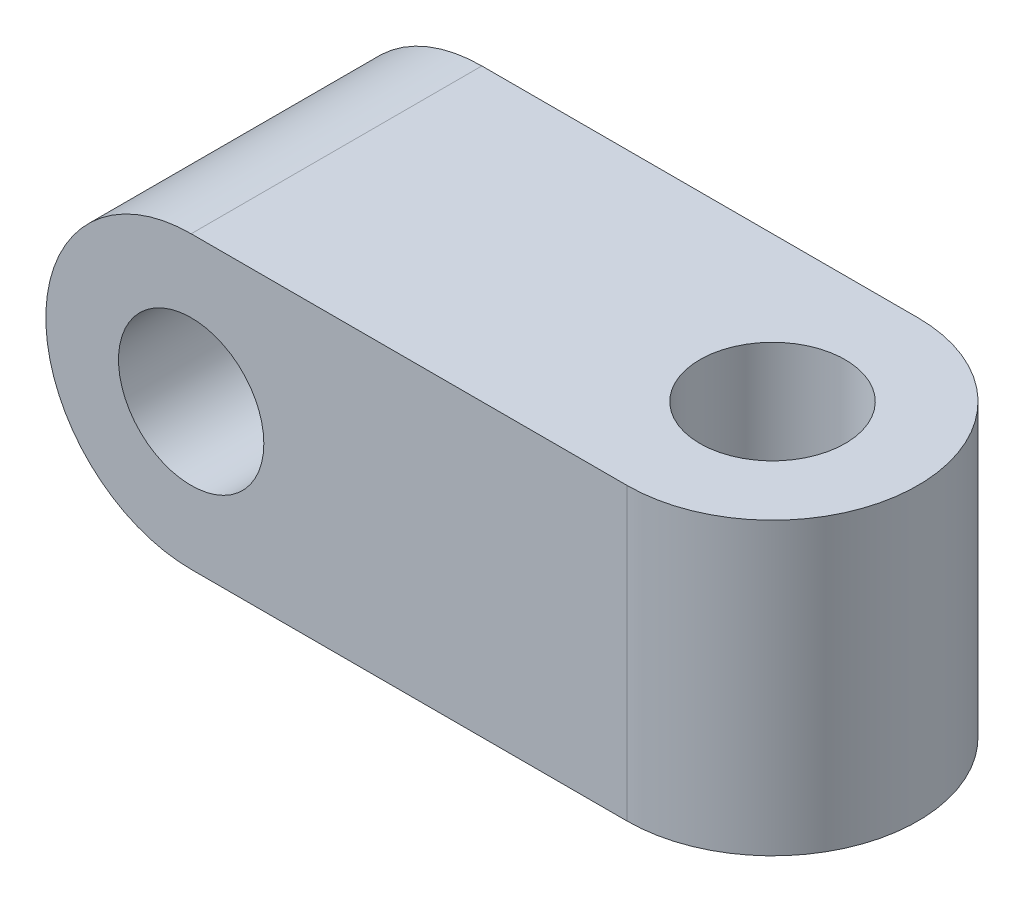
ISO-10303-21;
HEADER;
FILE_DESCRIPTION(('STEP AP214'),'2;1');
FILE_NAME('part.step','',(''),(''),'','','');
FILE_SCHEMA(('AUTOMOTIVE_DESIGN { 1 0 10303 214 1 1 1 1 }'));
ENDSEC;
DATA;
#1=APPLICATION_CONTEXT('core data for automotive mechanical design processes');
#2=APPLICATION_PROTOCOL_DEFINITION('international standard','automotive_design',2000,#1);
#3=PRODUCT_CONTEXT('',#1,'mechanical');
#4=PRODUCT('Part','Part','',(#3));
#5=PRODUCT_RELATED_PRODUCT_CATEGORY('part','',(#4));
#6=PRODUCT_DEFINITION_FORMATION('','',#4);
#7=PRODUCT_DEFINITION_CONTEXT('part definition',#1,'design');
#8=PRODUCT_DEFINITION('design','',#6,#7);
#9=PRODUCT_DEFINITION_SHAPE('','',#8);
#10=(LENGTH_UNIT() NAMED_UNIT(*) SI_UNIT(.MILLI.,.METRE.));
#11=(NAMED_UNIT(*) PLANE_ANGLE_UNIT() SI_UNIT($,.RADIAN.));
#12=(NAMED_UNIT(*) SI_UNIT($,.STERADIAN.) SOLID_ANGLE_UNIT());
#13=UNCERTAINTY_MEASURE_WITH_UNIT(LENGTH_MEASURE(1.E-05),#10,'distance_accuracy_value','');
#14=(GEOMETRIC_REPRESENTATION_CONTEXT(3) GLOBAL_UNCERTAINTY_ASSIGNED_CONTEXT((#13)) GLOBAL_UNIT_ASSIGNED_CONTEXT((#10,
#11,#12)) REPRESENTATION_CONTEXT('',''));
#15=CARTESIAN_POINT('',(0.,0.,0.));
#16=DIRECTION('',(0.,0.,1.));
#17=DIRECTION('',(1.,0.,0.));
#18=AXIS2_PLACEMENT_3D('',#15,#16,#17);
#19=CARTESIAN_POINT('',(0.,0.,4.));
#20=DIRECTION('',(0.,0.,-1.));
#21=DIRECTION('',(-1.,0.,0.));
#22=AXIS2_PLACEMENT_3D('',#19,#20,#21);
#23=CYLINDRICAL_SURFACE('',#22,2.);
#24=DIRECTION('',(0.,0.,1.));
#25=VECTOR('',#24,1.);
#26=CARTESIAN_POINT('',(0.,-2.,0.));
#27=LINE('',#26,#25);
#28=CARTESIAN_POINT('',(0.,-2.,0.));
#29=VERTEX_POINT('',#28);
#30=CARTESIAN_POINT('',(0.,-2.,4.));
#31=VERTEX_POINT('',#30);
#32=EDGE_CURVE('E55',#29,#31,#27,.T.);
#33=ORIENTED_EDGE('',*,*,#32,.T.);
#34=CARTESIAN_POINT('',(0.,0.,4.));
#35=DIRECTION('',(0.,0.,1.));
#36=DIRECTION('',(1.,0.,0.));
#37=AXIS2_PLACEMENT_3D('',#34,#35,#36);
#38=CIRCLE('',#37,2.);
#39=CARTESIAN_POINT('',(0.,2.,4.));
#40=VERTEX_POINT('',#39);
#41=EDGE_CURVE('E11',#40,#31,#38,.T.);
#42=ORIENTED_EDGE('',*,*,#41,.F.);
#43=DIRECTION('',(0.,0.,1.));
#44=VECTOR('',#43,1.);
#45=CARTESIAN_POINT('',(0.,2.,0.));
#46=LINE('',#45,#44);
#47=CARTESIAN_POINT('',(0.,2.,0.));
#48=VERTEX_POINT('',#47);
#49=EDGE_CURVE('E86',#48,#40,#46,.T.);
#50=ORIENTED_EDGE('',*,*,#49,.F.);
#51=CARTESIAN_POINT('',(0.,0.,0.));
#52=DIRECTION('',(0.,0.,1.));
#53=DIRECTION('',(1.,0.,0.));
#54=AXIS2_PLACEMENT_3D('',#51,#52,#53);
#55=CIRCLE('',#54,2.);
#56=EDGE_CURVE('E44',#48,#29,#55,.T.);
#57=ORIENTED_EDGE('',*,*,#56,.T.);
#58=EDGE_LOOP('',(#33,#42,#50,#57));
#59=FACE_BOUND('',#58,.T.);
#60=ADVANCED_FACE('F41',(#59),#23,.T.);
#61=CARTESIAN_POINT('',(0.,0.,4.));
#62=DIRECTION('',(0.,0.,1.));
#63=DIRECTION('',(1.,0.,0.));
#64=AXIS2_PLACEMENT_3D('',#61,#62,#63);
#65=PLANE('',#64);
#66=CARTESIAN_POINT('',(0.,0.,4.));
#67=DIRECTION('',(0.,0.,1.));
#68=DIRECTION('',(1.,0.,0.));
#69=AXIS2_PLACEMENT_3D('',#66,#67,#68);
#70=CIRCLE('',#69,1.);
#71=CARTESIAN_POINT('',(1.,0.,4.));
#72=VERTEX_POINT('',#71);
#73=EDGE_CURVE('E98',#72,#72,#70,.T.);
#74=ORIENTED_EDGE('',*,*,#73,.F.);
#75=EDGE_LOOP('',(#74));
#76=FACE_BOUND('',#75,.T.);
#77=ORIENTED_EDGE('',*,*,#41,.T.);
#78=DIRECTION('',(-1.,0.,0.));
#79=VECTOR('',#78,1.);
#80=CARTESIAN_POINT('',(0.,-2.,4.));
#81=LINE('',#80,#79);
#82=CARTESIAN_POINT('',(6.,-2.,4.));
#83=VERTEX_POINT('',#82);
#84=EDGE_CURVE('E89',#83,#31,#81,.T.);
#85=ORIENTED_EDGE('',*,*,#84,.F.);
#86=DIRECTION('',(0.,-1.,0.));
#87=VECTOR('',#86,1.);
#88=CARTESIAN_POINT('',(6.,2.,4.));
#89=LINE('',#88,#87);
#90=CARTESIAN_POINT('',(6.,2.,4.));
#91=VERTEX_POINT('',#90);
#92=EDGE_CURVE('E92',#91,#83,#89,.T.);
#93=ORIENTED_EDGE('',*,*,#92,.F.);
#94=DIRECTION('',(1.,0.,0.));
#95=VECTOR('',#94,1.);
#96=CARTESIAN_POINT('',(0.,2.,4.));
#97=LINE('',#96,#95);
#98=EDGE_CURVE('E78',#40,#91,#97,.T.);
#99=ORIENTED_EDGE('',*,*,#98,.F.);
#100=EDGE_LOOP('',(#77,#85,#93,#99));
#101=FACE_BOUND('',#100,.T.);
#102=ADVANCED_FACE('F93',(#76,#101),#65,.T.);
#103=CARTESIAN_POINT('',(0.,0.,0.));
#104=DIRECTION('',(0.,0.,1.));
#105=DIRECTION('',(1.,0.,0.));
#106=AXIS2_PLACEMENT_3D('',#103,#104,#105);
#107=PLANE('',#106);
#108=CARTESIAN_POINT('',(0.,0.,0.));
#109=DIRECTION('',(0.,0.,1.));
#110=DIRECTION('',(1.,0.,0.));
#111=AXIS2_PLACEMENT_3D('',#108,#109,#110);
#112=CIRCLE('',#111,1.);
#113=CARTESIAN_POINT('',(1.,0.,0.));
#114=VERTEX_POINT('',#113);
#115=EDGE_CURVE('E112',#114,#114,#112,.T.);
#116=ORIENTED_EDGE('',*,*,#115,.T.);
#117=EDGE_LOOP('',(#116));
#118=FACE_BOUND('',#117,.T.);
#119=ORIENTED_EDGE('',*,*,#56,.F.);
#120=DIRECTION('',(1.,0.,0.));
#121=VECTOR('',#120,1.);
#122=CARTESIAN_POINT('',(0.,2.,0.));
#123=LINE('',#122,#121);
#124=CARTESIAN_POINT('',(6.,2.,0.));
#125=VERTEX_POINT('',#124);
#126=EDGE_CURVE('E119',#48,#125,#123,.T.);
#127=ORIENTED_EDGE('',*,*,#126,.T.);
#128=DIRECTION('',(0.,-1.,0.));
#129=VECTOR('',#128,1.);
#130=CARTESIAN_POINT('',(6.,2.,0.));
#131=LINE('',#130,#129);
#132=CARTESIAN_POINT('',(6.,-2.,0.));
#133=VERTEX_POINT('',#132);
#134=EDGE_CURVE('E99',#125,#133,#131,.T.);
#135=ORIENTED_EDGE('',*,*,#134,.T.);
#136=DIRECTION('',(-1.,0.,0.));
#137=VECTOR('',#136,1.);
#138=CARTESIAN_POINT('',(0.,-2.,0.));
#139=LINE('',#138,#137);
#140=EDGE_CURVE('E88',#133,#29,#139,.T.);
#141=ORIENTED_EDGE('',*,*,#140,.T.);
#142=EDGE_LOOP('',(#119,#127,#135,#141));
#143=FACE_BOUND('',#142,.T.);
#144=ADVANCED_FACE('F124',(#118,#143),#107,.F.);
#145=CARTESIAN_POINT('',(0.,-2.,0.));
#146=DIRECTION('',(0.,1.,0.));
#147=DIRECTION('',(-1.,0.,0.));
#148=AXIS2_PLACEMENT_3D('',#145,#146,#147);
#149=PLANE('',#148);
#150=ORIENTED_EDGE('',*,*,#84,.T.);
#151=ORIENTED_EDGE('',*,*,#32,.F.);
#152=ORIENTED_EDGE('',*,*,#140,.F.);
#153=CARTESIAN_POINT('',(6.,-2.,2.));
#154=DIRECTION('',(0.,1.,0.));
#155=DIRECTION('',(0.,0.,-1.));
#156=AXIS2_PLACEMENT_3D('',#153,#154,#155);
#157=CIRCLE('',#156,2.);
#158=EDGE_CURVE('E103',#83,#133,#157,.T.);
#159=ORIENTED_EDGE('',*,*,#158,.F.);
#160=EDGE_LOOP('',(#150,#151,#152,#159));
#161=FACE_BOUND('',#160,.T.);
#162=CARTESIAN_POINT('',(6.,-2.,2.));
#163=DIRECTION('',(0.,1.,0.));
#164=DIRECTION('',(0.,0.,1.));
#165=AXIS2_PLACEMENT_3D('',#162,#163,#164);
#166=CIRCLE('',#165,1.);
#167=CARTESIAN_POINT('',(6.,-2.,3.));
#168=VERTEX_POINT('',#167);
#169=EDGE_CURVE('E109',#168,#168,#166,.T.);
#170=ORIENTED_EDGE('',*,*,#169,.T.);
#171=EDGE_LOOP('',(#170));
#172=FACE_BOUND('',#171,.T.);
#173=ADVANCED_FACE('F126',(#161,#172),#149,.F.);
#174=CARTESIAN_POINT('',(0.,2.,0.));
#175=DIRECTION('',(0.,-1.,0.));
#176=DIRECTION('',(1.,0.,0.));
#177=AXIS2_PLACEMENT_3D('',#174,#175,#176);
#178=PLANE('',#177);
#179=ORIENTED_EDGE('',*,*,#98,.T.);
#180=CARTESIAN_POINT('',(6.,2.,2.));
#181=DIRECTION('',(0.,1.,0.));
#182=DIRECTION('',(0.,0.,-1.));
#183=AXIS2_PLACEMENT_3D('',#180,#181,#182);
#184=CIRCLE('',#183,2.);
#185=EDGE_CURVE('E84',#91,#125,#184,.T.);
#186=ORIENTED_EDGE('',*,*,#185,.T.);
#187=ORIENTED_EDGE('',*,*,#126,.F.);
#188=ORIENTED_EDGE('',*,*,#49,.T.);
#189=EDGE_LOOP('',(#179,#186,#187,#188));
#190=FACE_BOUND('',#189,.T.);
#191=CARTESIAN_POINT('',(6.,2.,2.));
#192=DIRECTION('',(0.,1.,0.));
#193=DIRECTION('',(0.,0.,1.));
#194=AXIS2_PLACEMENT_3D('',#191,#192,#193);
#195=CIRCLE('',#194,1.);
#196=CARTESIAN_POINT('',(6.,2.,3.));
#197=VERTEX_POINT('',#196);
#198=EDGE_CURVE('E106',#197,#197,#195,.T.);
#199=ORIENTED_EDGE('',*,*,#198,.F.);
#200=EDGE_LOOP('',(#199));
#201=FACE_BOUND('',#200,.T.);
#202=ADVANCED_FACE('F80',(#190,#201),#178,.F.);
#203=CARTESIAN_POINT('',(0.,0.,0.));
#204=DIRECTION('',(0.,0.,1.));
#205=DIRECTION('',(1.,0.,0.));
#206=AXIS2_PLACEMENT_3D('',#203,#204,#205);
#207=CYLINDRICAL_SURFACE('',#206,1.);
#208=ORIENTED_EDGE('',*,*,#115,.F.);
#209=EDGE_LOOP('',(#208));
#210=FACE_BOUND('',#209,.T.);
#211=ORIENTED_EDGE('',*,*,#73,.T.);
#212=EDGE_LOOP('',(#211));
#213=FACE_BOUND('',#212,.T.);
#214=ADVANCED_FACE('F138',(#210,#213),#207,.F.);
#215=CARTESIAN_POINT('',(6.,2.,2.));
#216=DIRECTION('',(0.,-1.,0.));
#217=DIRECTION('',(0.,0.,-1.));
#218=AXIS2_PLACEMENT_3D('',#215,#216,#217);
#219=CYLINDRICAL_SURFACE('',#218,2.);
#220=ORIENTED_EDGE('',*,*,#158,.T.);
#221=ORIENTED_EDGE('',*,*,#134,.F.);
#222=ORIENTED_EDGE('',*,*,#185,.F.);
#223=ORIENTED_EDGE('',*,*,#92,.T.);
#224=EDGE_LOOP('',(#220,#221,#222,#223));
#225=FACE_BOUND('',#224,.T.);
#226=ADVANCED_FACE('F101',(#225),#219,.T.);
#227=CARTESIAN_POINT('',(6.,2.,2.));
#228=DIRECTION('',(0.,-1.,0.));
#229=DIRECTION('',(0.,0.,-1.));
#230=AXIS2_PLACEMENT_3D('',#227,#228,#229);
#231=CYLINDRICAL_SURFACE('',#230,1.);
#232=ORIENTED_EDGE('',*,*,#198,.T.);
#233=EDGE_LOOP('',(#232));
#234=FACE_BOUND('',#233,.T.);
#235=ORIENTED_EDGE('',*,*,#169,.F.);
#236=EDGE_LOOP('',(#235));
#237=FACE_BOUND('',#236,.T.);
#238=ADVANCED_FACE('F136',(#234,#237),#231,.F.);
#239=CLOSED_SHELL('',(#60,#102,#144,#173,#202,#214,#226,#238));
#240=MANIFOLD_SOLID_BREP('B2',#239);
#241=ADVANCED_BREP_SHAPE_REPRESENTATION('',(#18,#240),#14);
#242=SHAPE_DEFINITION_REPRESENTATION(#9,#241);
ENDSEC;
END-ISO-10303-21;
